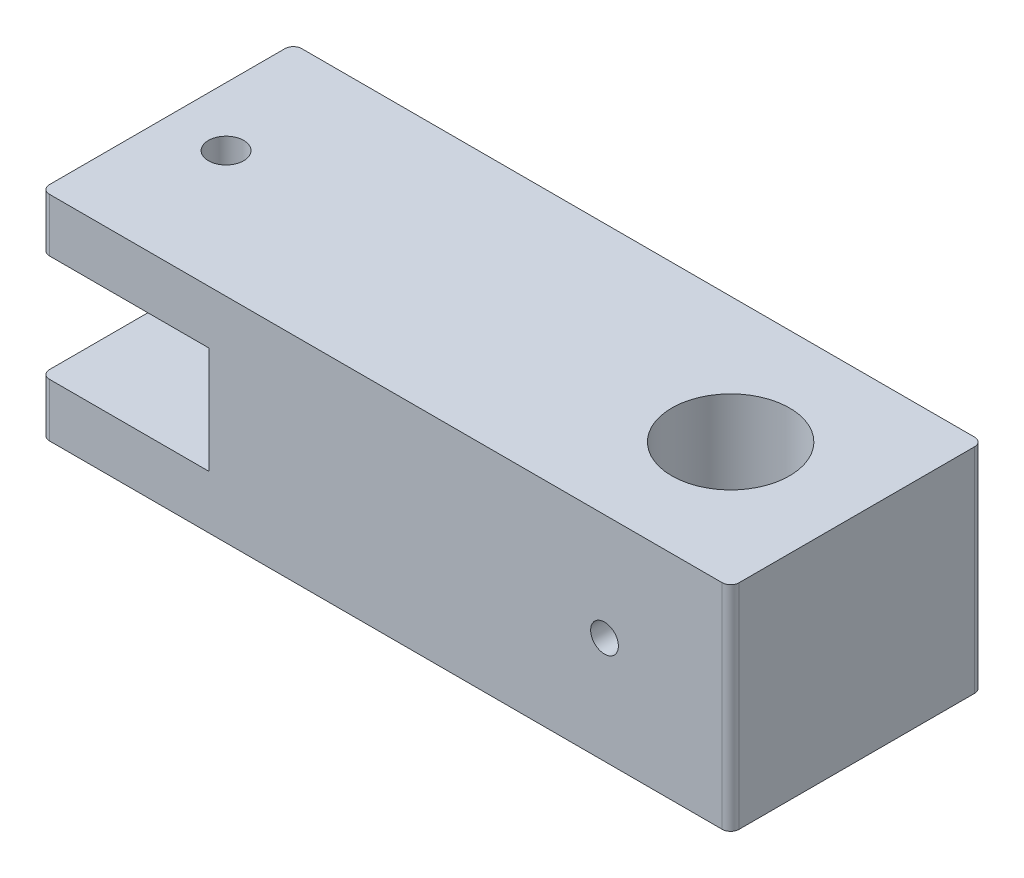
ISO-10303-21;
HEADER;
FILE_DESCRIPTION(('STEP AP214'),'2;1');
FILE_NAME('part.step','',(''),(''),'','','');
FILE_SCHEMA(('AUTOMOTIVE_DESIGN { 1 0 10303 214 1 1 1 1 }'));
ENDSEC;
DATA;
#1=APPLICATION_CONTEXT('core data for automotive mechanical design processes');
#2=APPLICATION_PROTOCOL_DEFINITION('international standard','automotive_design',2000,#1);
#3=PRODUCT_CONTEXT('',#1,'mechanical');
#4=PRODUCT('Part','Part','',(#3));
#5=PRODUCT_RELATED_PRODUCT_CATEGORY('part','',(#4));
#6=PRODUCT_DEFINITION_FORMATION('','',#4);
#7=PRODUCT_DEFINITION_CONTEXT('part definition',#1,'design');
#8=PRODUCT_DEFINITION('design','',#6,#7);
#9=PRODUCT_DEFINITION_SHAPE('','',#8);
#10=(LENGTH_UNIT() NAMED_UNIT(*) SI_UNIT(.MILLI.,.METRE.));
#11=(NAMED_UNIT(*) PLANE_ANGLE_UNIT() SI_UNIT($,.RADIAN.));
#12=(NAMED_UNIT(*) SI_UNIT($,.STERADIAN.) SOLID_ANGLE_UNIT());
#13=UNCERTAINTY_MEASURE_WITH_UNIT(LENGTH_MEASURE(1.E-05),#10,'distance_accuracy_value','');
#14=(GEOMETRIC_REPRESENTATION_CONTEXT(3) GLOBAL_UNCERTAINTY_ASSIGNED_CONTEXT((#13)) GLOBAL_UNIT_ASSIGNED_CONTEXT((#10,
#11,#12)) REPRESENTATION_CONTEXT('',''));
#15=CARTESIAN_POINT('',(0.,0.,0.));
#16=DIRECTION('',(0.,0.,1.));
#17=DIRECTION('',(1.,0.,0.));
#18=AXIS2_PLACEMENT_3D('',#15,#16,#17);
#19=CARTESIAN_POINT('',(-67.,-25.4,-15.));
#20=DIRECTION('',(-1.,0.,0.));
#21=DIRECTION('',(0.,0.,1.));
#22=AXIS2_PLACEMENT_3D('',#19,#20,#21);
#23=PLANE('',#22);
#24=DIRECTION('',(0.,0.,1.));
#25=VECTOR('',#24,1.);
#26=CARTESIAN_POINT('',(-67.,-19.05,-17.));
#27=LINE('',#26,#25);
#28=CARTESIAN_POINT('',(-67.,-19.05,-14.));
#29=VERTEX_POINT('',#28);
#30=CARTESIAN_POINT('',(-67.,-19.05,14.));
#31=VERTEX_POINT('',#30);
#32=EDGE_CURVE('E155',#29,#31,#27,.T.);
#33=ORIENTED_EDGE('',*,*,#32,.F.);
#34=DIRECTION('',(0.,1.,0.));
#35=VECTOR('',#34,1.);
#36=CARTESIAN_POINT('',(-67.,-25.4,-14.));
#37=LINE('',#36,#35);
#38=CARTESIAN_POINT('',(-67.,-25.4,-14.));
#39=VERTEX_POINT('',#38);
#40=EDGE_CURVE('E262',#29,#39,#37,.F.);
#41=ORIENTED_EDGE('',*,*,#40,.T.);
#42=DIRECTION('',(0.,0.,1.));
#43=VECTOR('',#42,1.);
#44=CARTESIAN_POINT('',(-67.,-25.4,-15.));
#45=LINE('',#44,#43);
#46=CARTESIAN_POINT('',(-67.,-25.4,14.));
#47=VERTEX_POINT('',#46);
#48=EDGE_CURVE('E203',#39,#47,#45,.T.);
#49=ORIENTED_EDGE('',*,*,#48,.T.);
#50=DIRECTION('',(0.,1.,0.));
#51=VECTOR('',#50,1.);
#52=CARTESIAN_POINT('',(-67.,-25.4,14.));
#53=LINE('',#52,#51);
#54=EDGE_CURVE('E259',#47,#31,#53,.T.);
#55=ORIENTED_EDGE('',*,*,#54,.T.);
#56=EDGE_LOOP('',(#33,#41,#49,#55));
#57=FACE_BOUND('',#56,.T.);
#58=ADVANCED_FACE('F33',(#57),#23,.T.);
#59=CARTESIAN_POINT('',(-60.,-25.4,0.));
#60=DIRECTION('',(0.,1.,0.));
#61=DIRECTION('',(0.,0.,1.));
#62=AXIS2_PLACEMENT_3D('',#59,#60,#61);
#63=CYLINDRICAL_SURFACE('',#62,2.1);
#64=CARTESIAN_POINT('',(-60.,-25.4,0.));
#65=DIRECTION('',(0.,1.,0.));
#66=DIRECTION('',(0.,0.,1.));
#67=AXIS2_PLACEMENT_3D('',#64,#65,#66);
#68=CIRCLE('',#67,2.1);
#69=CARTESIAN_POINT('',(-60.,-25.4,2.1));
#70=VERTEX_POINT('',#69);
#71=EDGE_CURVE('E191',#70,#70,#68,.T.);
#72=ORIENTED_EDGE('',*,*,#71,.F.);
#73=EDGE_LOOP('',(#72));
#74=FACE_BOUND('',#73,.T.);
#75=CARTESIAN_POINT('',(-60.,-19.05,0.));
#76=DIRECTION('',(0.,1.,0.));
#77=DIRECTION('',(0.,0.,1.));
#78=AXIS2_PLACEMENT_3D('',#75,#76,#77);
#79=CIRCLE('',#78,2.1);
#80=CARTESIAN_POINT('',(-60.,-19.05,2.1));
#81=VERTEX_POINT('',#80);
#82=EDGE_CURVE('E176',#81,#81,#79,.F.);
#83=ORIENTED_EDGE('',*,*,#82,.F.);
#84=EDGE_LOOP('',(#83));
#85=FACE_BOUND('',#84,.T.);
#86=ADVANCED_FACE('F302',(#74,#85),#63,.F.);
#87=CARTESIAN_POINT('',(15.,-25.4,-15.));
#88=DIRECTION('',(1.,0.,0.));
#89=DIRECTION('',(0.,0.,-1.));
#90=AXIS2_PLACEMENT_3D('',#87,#88,#89);
#91=PLANE('',#90);
#92=DIRECTION('',(0.,0.,-1.));
#93=VECTOR('',#92,1.);
#94=CARTESIAN_POINT('',(15.,-25.4,-15.));
#95=LINE('',#94,#93);
#96=CARTESIAN_POINT('',(15.,-25.4,14.));
#97=VERTEX_POINT('',#96);
#98=CARTESIAN_POINT('',(15.,-25.4,-14.));
#99=VERTEX_POINT('',#98);
#100=EDGE_CURVE('E197',#97,#99,#95,.T.);
#101=ORIENTED_EDGE('',*,*,#100,.T.);
#102=DIRECTION('',(0.,1.,0.));
#103=VECTOR('',#102,1.);
#104=CARTESIAN_POINT('',(15.,-25.4,-14.));
#105=LINE('',#104,#103);
#106=CARTESIAN_POINT('',(15.,0.,-14.));
#107=VERTEX_POINT('',#106);
#108=EDGE_CURVE('E11',#99,#107,#105,.T.);
#109=ORIENTED_EDGE('',*,*,#108,.T.);
#110=DIRECTION('',(0.,0.,-1.));
#111=VECTOR('',#110,1.);
#112=CARTESIAN_POINT('',(15.,0.,-15.));
#113=LINE('',#112,#111);
#114=CARTESIAN_POINT('',(15.,0.,14.));
#115=VERTEX_POINT('',#114);
#116=EDGE_CURVE('E194',#115,#107,#113,.T.);
#117=ORIENTED_EDGE('',*,*,#116,.F.);
#118=DIRECTION('',(0.,1.,0.));
#119=VECTOR('',#118,1.);
#120=CARTESIAN_POINT('',(15.,-25.4,14.));
#121=LINE('',#120,#119);
#122=EDGE_CURVE('E47',#115,#97,#121,.F.);
#123=ORIENTED_EDGE('',*,*,#122,.T.);
#124=EDGE_LOOP('',(#101,#109,#117,#123));
#125=FACE_BOUND('',#124,.T.);
#126=ADVANCED_FACE('F309',(#125),#91,.T.);
#127=CARTESIAN_POINT('',(-67.,-25.4,15.));
#128=DIRECTION('',(0.,0.,1.));
#129=DIRECTION('',(1.,0.,0.));
#130=AXIS2_PLACEMENT_3D('',#127,#128,#129);
#131=PLANE('',#130);
#132=CARTESIAN_POINT('',(0.,-12.7,15.));
#133=DIRECTION('',(0.,0.,1.));
#134=DIRECTION('',(1.,0.,0.));
#135=AXIS2_PLACEMENT_3D('',#132,#133,#134);
#136=CIRCLE('',#135,1.65);
#137=CARTESIAN_POINT('',(1.65,-12.7,15.));
#138=VERTEX_POINT('',#137);
#139=EDGE_CURVE('E517',#138,#138,#136,.T.);
#140=ORIENTED_EDGE('',*,*,#139,.F.);
#141=EDGE_LOOP('',(#140));
#142=FACE_BOUND('',#141,.T.);
#143=DIRECTION('',(1.,0.,0.));
#144=VECTOR('',#143,1.);
#145=CARTESIAN_POINT('',(-67.,0.,15.));
#146=LINE('',#145,#144);
#147=CARTESIAN_POINT('',(-66.,0.,15.));
#148=VERTEX_POINT('',#147);
#149=CARTESIAN_POINT('',(14.,0.,15.));
#150=VERTEX_POINT('',#149);
#151=EDGE_CURVE('E200',#148,#150,#146,.T.);
#152=ORIENTED_EDGE('',*,*,#151,.F.);
#153=DIRECTION('',(0.,1.,0.));
#154=VECTOR('',#153,1.);
#155=CARTESIAN_POINT('',(-66.,-25.4,15.));
#156=LINE('',#155,#154);
#157=CARTESIAN_POINT('',(-66.,-6.35,15.));
#158=VERTEX_POINT('',#157);
#159=EDGE_CURVE('E242',#148,#158,#156,.F.);
#160=ORIENTED_EDGE('',*,*,#159,.T.);
#161=DIRECTION('',(-1.,0.,0.));
#162=VECTOR('',#161,1.);
#163=CARTESIAN_POINT('',(-47.,-6.35,15.));
#164=LINE('',#163,#162);
#165=CARTESIAN_POINT('',(-47.,-6.35,15.));
#166=VERTEX_POINT('',#165);
#167=EDGE_CURVE('E165',#166,#158,#164,.T.);
#168=ORIENTED_EDGE('',*,*,#167,.F.);
#169=DIRECTION('',(0.,-1.,0.));
#170=VECTOR('',#169,1.);
#171=CARTESIAN_POINT('',(-47.,-6.35,15.));
#172=LINE('',#171,#170);
#173=CARTESIAN_POINT('',(-47.,-19.05,15.));
#174=VERTEX_POINT('',#173);
#175=EDGE_CURVE('E148',#166,#174,#172,.T.);
#176=ORIENTED_EDGE('',*,*,#175,.T.);
#177=DIRECTION('',(-1.,0.,0.));
#178=VECTOR('',#177,1.);
#179=CARTESIAN_POINT('',(-47.,-19.05,15.));
#180=LINE('',#179,#178);
#181=CARTESIAN_POINT('',(-66.,-19.05,15.));
#182=VERTEX_POINT('',#181);
#183=EDGE_CURVE('E158',#174,#182,#180,.T.);
#184=ORIENTED_EDGE('',*,*,#183,.T.);
#185=DIRECTION('',(0.,1.,0.));
#186=VECTOR('',#185,1.);
#187=CARTESIAN_POINT('',(-66.,-25.4,15.));
#188=LINE('',#187,#186);
#189=CARTESIAN_POINT('',(-66.,-25.4,15.));
#190=VERTEX_POINT('',#189);
#191=EDGE_CURVE('E237',#182,#190,#188,.F.);
#192=ORIENTED_EDGE('',*,*,#191,.T.);
#193=DIRECTION('',(1.,0.,0.));
#194=VECTOR('',#193,1.);
#195=CARTESIAN_POINT('',(-67.,-25.4,15.));
#196=LINE('',#195,#194);
#197=CARTESIAN_POINT('',(14.,-25.4,15.));
#198=VERTEX_POINT('',#197);
#199=EDGE_CURVE('E206',#190,#198,#196,.T.);
#200=ORIENTED_EDGE('',*,*,#199,.T.);
#201=DIRECTION('',(0.,1.,0.));
#202=VECTOR('',#201,1.);
#203=CARTESIAN_POINT('',(14.,-25.4,15.));
#204=LINE('',#203,#202);
#205=EDGE_CURVE('E239',#198,#150,#204,.T.);
#206=ORIENTED_EDGE('',*,*,#205,.T.);
#207=EDGE_LOOP('',(#152,#160,#168,#176,#184,#192,#200,#206));
#208=FACE_BOUND('',#207,.T.);
#209=ADVANCED_FACE('F168',(#142,#208),#131,.T.);
#210=DIRECTION('',(0.,0.,1.));
#211=VECTOR('',#210,1.);
#212=CARTESIAN_POINT('',(-67.,-6.35,-17.));
#213=LINE('',#212,#211);
#214=CARTESIAN_POINT('',(-67.,-6.35,-14.));
#215=VERTEX_POINT('',#214);
#216=CARTESIAN_POINT('',(-67.,-6.35,14.));
#217=VERTEX_POINT('',#216);
#218=EDGE_CURVE('E170',#215,#217,#213,.T.);
#219=ORIENTED_EDGE('',*,*,#218,.T.);
#220=DIRECTION('',(0.,1.,0.));
#221=VECTOR('',#220,1.);
#222=CARTESIAN_POINT('',(-67.,-25.4,14.));
#223=LINE('',#222,#221);
#224=CARTESIAN_POINT('',(-67.,0.,14.));
#225=VERTEX_POINT('',#224);
#226=EDGE_CURVE('E226',#217,#225,#223,.T.);
#227=ORIENTED_EDGE('',*,*,#226,.T.);
#228=DIRECTION('',(0.,0.,1.));
#229=VECTOR('',#228,1.);
#230=CARTESIAN_POINT('',(-67.,0.,-15.));
#231=LINE('',#230,#229);
#232=CARTESIAN_POINT('',(-67.,0.,-14.));
#233=VERTEX_POINT('',#232);
#234=EDGE_CURVE('E214',#233,#225,#231,.T.);
#235=ORIENTED_EDGE('',*,*,#234,.F.);
#236=DIRECTION('',(0.,1.,0.));
#237=VECTOR('',#236,1.);
#238=CARTESIAN_POINT('',(-67.,-25.4,-14.));
#239=LINE('',#238,#237);
#240=EDGE_CURVE('E224',#233,#215,#239,.F.);
#241=ORIENTED_EDGE('',*,*,#240,.T.);
#242=EDGE_LOOP('',(#219,#227,#235,#241));
#243=FACE_BOUND('',#242,.T.);
#244=ADVANCED_FACE('F305',(#243),#23,.T.);
#245=CARTESIAN_POINT('',(-67.,-25.4,-15.));
#246=DIRECTION('',(0.,0.,-1.));
#247=DIRECTION('',(-1.,0.,0.));
#248=AXIS2_PLACEMENT_3D('',#245,#246,#247);
#249=PLANE('',#248);
#250=CARTESIAN_POINT('',(0.,-12.7,-15.));
#251=DIRECTION('',(0.,0.,1.));
#252=DIRECTION('',(1.,0.,0.));
#253=AXIS2_PLACEMENT_3D('',#250,#251,#252);
#254=CIRCLE('',#253,1.65);
#255=CARTESIAN_POINT('',(1.65,-12.7,-15.));
#256=VERTEX_POINT('',#255);
#257=EDGE_CURVE('E276',#256,#256,#254,.T.);
#258=ORIENTED_EDGE('',*,*,#257,.T.);
#259=EDGE_LOOP('',(#258));
#260=FACE_BOUND('',#259,.T.);
#261=DIRECTION('',(1.,0.,0.));
#262=VECTOR('',#261,1.);
#263=CARTESIAN_POINT('',(-67.,-6.35,-15.));
#264=LINE('',#263,#262);
#265=CARTESIAN_POINT('',(-66.,-6.35,-15.));
#266=VERTEX_POINT('',#265);
#267=CARTESIAN_POINT('',(-47.,-6.35,-15.));
#268=VERTEX_POINT('',#267);
#269=EDGE_CURVE('E182',#266,#268,#264,.T.);
#270=ORIENTED_EDGE('',*,*,#269,.F.);
#271=DIRECTION('',(0.,1.,0.));
#272=VECTOR('',#271,1.);
#273=CARTESIAN_POINT('',(-66.,-25.4,-15.));
#274=LINE('',#273,#272);
#275=CARTESIAN_POINT('',(-66.,0.,-15.));
#276=VERTEX_POINT('',#275);
#277=EDGE_CURVE('E253',#266,#276,#274,.T.);
#278=ORIENTED_EDGE('',*,*,#277,.T.);
#279=DIRECTION('',(-1.,0.,0.));
#280=VECTOR('',#279,1.);
#281=CARTESIAN_POINT('',(-67.,0.,-15.));
#282=LINE('',#281,#280);
#283=CARTESIAN_POINT('',(14.,0.,-15.));
#284=VERTEX_POINT('',#283);
#285=EDGE_CURVE('E211',#284,#276,#282,.T.);
#286=ORIENTED_EDGE('',*,*,#285,.F.);
#287=DIRECTION('',(0.,1.,0.));
#288=VECTOR('',#287,1.);
#289=CARTESIAN_POINT('',(14.,-25.4,-15.));
#290=LINE('',#289,#288);
#291=CARTESIAN_POINT('',(14.,-25.4,-15.));
#292=VERTEX_POINT('',#291);
#293=EDGE_CURVE('E248',#284,#292,#290,.F.);
#294=ORIENTED_EDGE('',*,*,#293,.T.);
#295=DIRECTION('',(-1.,0.,0.));
#296=VECTOR('',#295,1.);
#297=CARTESIAN_POINT('',(-67.,-25.4,-15.));
#298=LINE('',#297,#296);
#299=CARTESIAN_POINT('',(-66.,-25.4,-15.));
#300=VERTEX_POINT('',#299);
#301=EDGE_CURVE('E199',#292,#300,#298,.T.);
#302=ORIENTED_EDGE('',*,*,#301,.T.);
#303=DIRECTION('',(0.,1.,0.));
#304=VECTOR('',#303,1.);
#305=CARTESIAN_POINT('',(-66.,-25.4,-15.));
#306=LINE('',#305,#304);
#307=CARTESIAN_POINT('',(-66.,-19.05,-15.));
#308=VERTEX_POINT('',#307);
#309=EDGE_CURVE('E250',#300,#308,#306,.T.);
#310=ORIENTED_EDGE('',*,*,#309,.T.);
#311=DIRECTION('',(1.,0.,0.));
#312=VECTOR('',#311,1.);
#313=CARTESIAN_POINT('',(-67.,-19.05,-15.));
#314=LINE('',#313,#312);
#315=CARTESIAN_POINT('',(-47.,-19.05,-15.));
#316=VERTEX_POINT('',#315);
#317=EDGE_CURVE('E179',#308,#316,#314,.T.);
#318=ORIENTED_EDGE('',*,*,#317,.T.);
#319=DIRECTION('',(0.,1.,0.));
#320=VECTOR('',#319,1.);
#321=CARTESIAN_POINT('',(-47.,-25.4,-15.));
#322=LINE('',#321,#320);
#323=EDGE_CURVE('E151',#316,#268,#322,.T.);
#324=ORIENTED_EDGE('',*,*,#323,.T.);
#325=EDGE_LOOP('',(#270,#278,#286,#294,#302,#310,#318,#324));
#326=FACE_BOUND('',#325,.T.);
#327=ADVANCED_FACE('F315',(#260,#326),#249,.T.);
#328=CARTESIAN_POINT('',(0.,-25.4,0.));
#329=DIRECTION('',(0.,1.,0.));
#330=DIRECTION('',(0.,0.,1.));
#331=AXIS2_PLACEMENT_3D('',#328,#329,#330);
#332=PLANE('',#331);
#333=CARTESIAN_POINT('',(0.,-25.4,0.));
#334=DIRECTION('',(0.,1.,0.));
#335=DIRECTION('',(0.,0.,1.));
#336=AXIS2_PLACEMENT_3D('',#333,#334,#335);
#337=CIRCLE('',#336,7.);
#338=CARTESIAN_POINT('',(0.,-25.4,7.));
#339=VERTEX_POINT('',#338);
#340=EDGE_CURVE('E185',#339,#339,#337,.T.);
#341=ORIENTED_EDGE('',*,*,#340,.T.);
#342=EDGE_LOOP('',(#341));
#343=FACE_BOUND('',#342,.T.);
#344=ORIENTED_EDGE('',*,*,#71,.T.);
#345=EDGE_LOOP('',(#344));
#346=FACE_BOUND('',#345,.T.);
#347=ORIENTED_EDGE('',*,*,#48,.F.);
#348=CARTESIAN_POINT('',(-66.,-25.4,-14.));
#349=DIRECTION('',(0.,1.,0.));
#350=DIRECTION('',(0.,0.,1.));
#351=AXIS2_PLACEMENT_3D('',#348,#349,#350);
#352=CIRCLE('',#351,1.);
#353=EDGE_CURVE('E269',#39,#300,#352,.F.);
#354=ORIENTED_EDGE('',*,*,#353,.T.);
#355=ORIENTED_EDGE('',*,*,#301,.F.);
#356=CARTESIAN_POINT('',(14.,-25.4,-14.));
#357=DIRECTION('',(0.,1.,0.));
#358=DIRECTION('',(0.,0.,1.));
#359=AXIS2_PLACEMENT_3D('',#356,#357,#358);
#360=CIRCLE('',#359,1.);
#361=EDGE_CURVE('E55',#292,#99,#360,.F.);
#362=ORIENTED_EDGE('',*,*,#361,.T.);
#363=ORIENTED_EDGE('',*,*,#100,.F.);
#364=CARTESIAN_POINT('',(14.,-25.4,14.));
#365=DIRECTION('',(0.,1.,0.));
#366=DIRECTION('',(0.,0.,1.));
#367=AXIS2_PLACEMENT_3D('',#364,#365,#366);
#368=CIRCLE('',#367,1.);
#369=EDGE_CURVE('E266',#97,#198,#368,.F.);
#370=ORIENTED_EDGE('',*,*,#369,.T.);
#371=ORIENTED_EDGE('',*,*,#199,.F.);
#372=CARTESIAN_POINT('',(-66.,-25.4,14.));
#373=DIRECTION('',(0.,1.,0.));
#374=DIRECTION('',(0.,0.,1.));
#375=AXIS2_PLACEMENT_3D('',#372,#373,#374);
#376=CIRCLE('',#375,1.);
#377=EDGE_CURVE('E264',#190,#47,#376,.F.);
#378=ORIENTED_EDGE('',*,*,#377,.T.);
#379=EDGE_LOOP('',(#347,#354,#355,#362,#363,#370,#371,#378));
#380=FACE_BOUND('',#379,.T.);
#381=ADVANCED_FACE('F321',(#343,#346,#380),#332,.F.);
#382=CARTESIAN_POINT('',(0.,0.,0.));
#383=DIRECTION('',(0.,1.,0.));
#384=DIRECTION('',(0.,0.,1.));
#385=AXIS2_PLACEMENT_3D('',#382,#383,#384);
#386=PLANE('',#385);
#387=CARTESIAN_POINT('',(0.,0.,0.));
#388=DIRECTION('',(0.,1.,0.));
#389=DIRECTION('',(0.,0.,1.));
#390=AXIS2_PLACEMENT_3D('',#387,#388,#389);
#391=CIRCLE('',#390,7.);
#392=CARTESIAN_POINT('',(0.,0.,7.));
#393=VERTEX_POINT('',#392);
#394=EDGE_CURVE('E184',#393,#393,#391,.T.);
#395=ORIENTED_EDGE('',*,*,#394,.F.);
#396=EDGE_LOOP('',(#395));
#397=FACE_BOUND('',#396,.T.);
#398=CARTESIAN_POINT('',(-60.,0.,0.));
#399=DIRECTION('',(0.,1.,0.));
#400=DIRECTION('',(0.,0.,1.));
#401=AXIS2_PLACEMENT_3D('',#398,#399,#400);
#402=CIRCLE('',#401,2.1);
#403=CARTESIAN_POINT('',(-60.,0.,2.1));
#404=VERTEX_POINT('',#403);
#405=EDGE_CURVE('E188',#404,#404,#402,.T.);
#406=ORIENTED_EDGE('',*,*,#405,.F.);
#407=EDGE_LOOP('',(#406));
#408=FACE_BOUND('',#407,.T.);
#409=ORIENTED_EDGE('',*,*,#234,.T.);
#410=CARTESIAN_POINT('',(-66.,0.,14.));
#411=DIRECTION('',(0.,1.,0.));
#412=DIRECTION('',(0.,0.,1.));
#413=AXIS2_PLACEMENT_3D('',#410,#411,#412);
#414=CIRCLE('',#413,1.);
#415=EDGE_CURVE('E235',#225,#148,#414,.T.);
#416=ORIENTED_EDGE('',*,*,#415,.T.);
#417=ORIENTED_EDGE('',*,*,#151,.T.);
#418=CARTESIAN_POINT('',(14.,0.,14.));
#419=DIRECTION('',(0.,1.,0.));
#420=DIRECTION('',(0.,0.,1.));
#421=AXIS2_PLACEMENT_3D('',#418,#419,#420);
#422=CIRCLE('',#421,1.);
#423=EDGE_CURVE('E229',#150,#115,#422,.T.);
#424=ORIENTED_EDGE('',*,*,#423,.T.);
#425=ORIENTED_EDGE('',*,*,#116,.T.);
#426=CARTESIAN_POINT('',(14.,0.,-14.));
#427=DIRECTION('',(0.,1.,0.));
#428=DIRECTION('',(0.,0.,1.));
#429=AXIS2_PLACEMENT_3D('',#426,#427,#428);
#430=CIRCLE('',#429,1.);
#431=EDGE_CURVE('E231',#107,#284,#430,.T.);
#432=ORIENTED_EDGE('',*,*,#431,.T.);
#433=ORIENTED_EDGE('',*,*,#285,.T.);
#434=CARTESIAN_POINT('',(-66.,0.,-14.));
#435=DIRECTION('',(0.,1.,0.));
#436=DIRECTION('',(0.,0.,1.));
#437=AXIS2_PLACEMENT_3D('',#434,#435,#436);
#438=CIRCLE('',#437,1.);
#439=EDGE_CURVE('E233',#276,#233,#438,.T.);
#440=ORIENTED_EDGE('',*,*,#439,.T.);
#441=EDGE_LOOP('',(#409,#416,#417,#424,#425,#432,#433,#440));
#442=FACE_BOUND('',#441,.T.);
#443=ADVANCED_FACE('F333',(#397,#408,#442),#386,.T.);
#444=CARTESIAN_POINT('',(-60.,-6.35,0.));
#445=DIRECTION('',(0.,1.,0.));
#446=DIRECTION('',(0.,0.,1.));
#447=AXIS2_PLACEMENT_3D('',#444,#445,#446);
#448=CIRCLE('',#447,2.1);
#449=CARTESIAN_POINT('',(-60.,-6.35,2.1));
#450=VERTEX_POINT('',#449);
#451=EDGE_CURVE('E181',#450,#450,#448,.F.);
#452=ORIENTED_EDGE('',*,*,#451,.T.);
#453=EDGE_LOOP('',(#452));
#454=FACE_BOUND('',#453,.T.);
#455=ORIENTED_EDGE('',*,*,#405,.T.);
#456=EDGE_LOOP('',(#455));
#457=FACE_BOUND('',#456,.T.);
#458=ADVANCED_FACE('F298',(#454,#457),#63,.F.);
#459=CARTESIAN_POINT('',(0.,-25.4,0.));
#460=DIRECTION('',(0.,1.,0.));
#461=DIRECTION('',(0.,0.,1.));
#462=AXIS2_PLACEMENT_3D('',#459,#460,#461);
#463=CYLINDRICAL_SURFACE('',#462,7.);
#464=CARTESIAN_POINT('',(0.,-14.35,7.));
#465=CARTESIAN_POINT('',(0.0913287393176132,-14.3499971561209,6.99999836647252));
#466=CARTESIAN_POINT('',(0.182690417283303,-14.3423917691506,6.99819467849873));
#467=CARTESIAN_POINT('',(0.36280632366436,-14.3122100985305,6.9911739036526));
#468=CARTESIAN_POINT('',(0.451558855012933,-14.2896242867252,6.98595464436713));
#469=CARTESIAN_POINT('',(0.623828476855956,-14.2302382259825,6.97268218331077));
#470=CARTESIAN_POINT('',(0.707351348819675,-14.193454007993,6.96463217854926));
#471=CARTESIAN_POINT('',(0.867039208328407,-14.1067691512847,6.9465609541058));
#472=CARTESIAN_POINT('',(0.943204151262113,-14.0568684330471,6.93653972247338));
#473=CARTESIAN_POINT('',(1.0874214344422,-13.9443931783477,6.91541181493805));
#474=CARTESIAN_POINT('',(1.15531854158778,-13.8816224464447,6.90428991213628));
#475=CARTESIAN_POINT('',(1.2797250827413,-13.7456095908267,6.88231817514457));
#476=CARTESIAN_POINT('',(1.33623336463363,-13.6723664089783,6.87146836857753));
#477=CARTESIAN_POINT('',(1.43696684618771,-13.516309632544,6.85111743990827));
#478=CARTESIAN_POINT('',(1.48102236520305,-13.4333837495766,6.84163573776828));
#479=CARTESIAN_POINT('',(1.5545098915109,-13.2610442782979,6.8253150534534));
#480=CARTESIAN_POINT('',(1.58394395433771,-13.1716316039485,6.81847569983819));
#481=CARTESIAN_POINT('',(1.62683125284545,-12.990553027969,6.80836995693017));
#482=CARTESIAN_POINT('',(1.64056162843084,-12.8989562957756,6.80504168835829));
#483=CARTESIAN_POINT('',(1.6525143545755,-12.7147036463359,6.80214944752779));
#484=CARTESIAN_POINT('',(1.65073893306961,-12.622047883166,6.80258493447765));
#485=CARTESIAN_POINT('',(1.63195247769315,-12.4404008192041,6.80711518628286));
#486=CARTESIAN_POINT('',(1.61526770664355,-12.3513735200367,6.81113158544197));
#487=CARTESIAN_POINT('',(1.56765494743683,-12.1774184804874,6.82224669705885));
#488=CARTESIAN_POINT('',(1.53672604569693,-12.092491003444,6.82934560721949));
#489=CARTESIAN_POINT('',(1.46121486998613,-11.9282516029474,6.84590028619908));
#490=CARTESIAN_POINT('',(1.41651088097455,-11.8489978306035,6.85537691977426));
#491=CARTESIAN_POINT('',(1.31480384080152,-11.6989978790521,6.87560701771075));
#492=CARTESIAN_POINT('',(1.25779885989578,-11.6282530374163,6.88636068228985));
#493=CARTESIAN_POINT('',(1.13140044923306,-11.4954052023035,6.90826612497408));
#494=CARTESIAN_POINT('',(1.06173067039407,-11.433565372046,6.91942110106382));
#495=CARTESIAN_POINT('',(0.912878848692459,-11.3224003529991,6.940626418642));
#496=CARTESIAN_POINT('',(0.833696575268989,-11.2730754676331,6.95067673334471));
#497=CARTESIAN_POINT('',(0.667717693598601,-11.1882589765205,6.9685816950737));
#498=CARTESIAN_POINT('',(0.580900533100761,-11.1528062013209,6.97643016161576));
#499=CARTESIAN_POINT('',(0.402313719817366,-11.0970684465634,6.98900179511064));
#500=CARTESIAN_POINT('',(0.310544909289167,-11.0767808961225,6.99372549177409));
#501=CARTESIAN_POINT('',(0.126913198899209,-11.0523423156672,6.9994383716222));
#502=CARTESIAN_POINT('',(0.0351005767602216,-11.0478324033013,7.00051059686152));
#503=CARTESIAN_POINT('',(-0.147966685501655,-11.0540982763691,6.99903444009398));
#504=CARTESIAN_POINT('',(-0.239221369368363,-11.0648728476162,6.99648634568227));
#505=CARTESIAN_POINT('',(-0.41736265301977,-11.1011050792374,6.98810869992012));
#506=CARTESIAN_POINT('',(-0.504290552421104,-11.1263705135243,6.98232213187254));
#507=CARTESIAN_POINT('',(-0.672672276070119,-11.1906506508764,6.96811723407212));
#508=CARTESIAN_POINT('',(-0.75412558464871,-11.2296666469956,6.9596986568229));
#509=CARTESIAN_POINT('',(-0.910700498955396,-11.3210604220864,6.94096161251794));
#510=CARTESIAN_POINT('',(-0.985698570997651,-11.373643860576,6.93061465221504));
#511=CARTESIAN_POINT('',(-1.1259344495591,-11.4904133192425,6.90921937825115));
#512=CARTESIAN_POINT('',(-1.19117076625592,-11.5546011071611,6.89817095790026));
#513=CARTESIAN_POINT('',(-1.31148229591091,-11.694415055306,6.87632466673189));
#514=CARTESIAN_POINT('',(-1.36630717929423,-11.7702586125966,6.865537385707));
#515=CARTESIAN_POINT('',(-1.46244648293612,-11.9302847923245,6.84570445168464));
#516=CARTESIAN_POINT('',(-1.50376150719305,-12.0144670417364,6.83665872083343));
#517=CARTESIAN_POINT('',(-1.57141076668764,-12.1883212744608,6.82142736146698));
#518=CARTESIAN_POINT('',(-1.59783286852026,-12.2779575268584,6.81522499881539));
#519=CARTESIAN_POINT('',(-1.63519178674544,-12.4605656558368,6.80635903572141));
#520=CARTESIAN_POINT('',(-1.64613154940225,-12.5535368943212,6.80369476199233));
#521=CARTESIAN_POINT('',(-1.65207449167986,-12.7376400758363,6.80225382726605));
#522=CARTESIAN_POINT('',(-1.6474761616919,-12.8287586131014,6.8033799546054));
#523=CARTESIAN_POINT('',(-1.62337546677893,-13.0088823636668,6.80917049161347));
#524=CARTESIAN_POINT('',(-1.6038733396724,-13.0978876106654,6.81383484482306));
#525=CARTESIAN_POINT('',(-1.55072477614989,-13.2708801060627,6.82612522897376));
#526=CARTESIAN_POINT('',(-1.51714519678737,-13.3548889577515,6.83373724790254));
#527=CARTESIAN_POINT('',(-1.43684939858625,-13.5161365114797,6.85106877692285));
#528=CARTESIAN_POINT('',(-1.39013156490448,-13.5933743797552,6.86078854604759));
#529=CARTESIAN_POINT('',(-1.28360204537891,-13.7408316517026,6.88152384189012));
#530=CARTESIAN_POINT('',(-1.22351026298738,-13.8108452311053,6.89256431174075));
#531=CARTESIAN_POINT('',(-1.09249493531384,-13.9399248388899,6.91453965388042));
#532=CARTESIAN_POINT('',(-1.02156885982584,-13.9989883028659,6.92547450086677));
#533=CARTESIAN_POINT('',(-0.869562734220027,-14.10538285533,6.9462096972569));
#534=CARTESIAN_POINT('',(-0.788341489140674,-14.1525164535641,6.95598967744618));
#535=CARTESIAN_POINT('',(-0.618909771082385,-14.232386209572,6.97310375804727));
#536=CARTESIAN_POINT('',(-0.53070477860151,-14.2651335273768,6.98043975328753));
#537=CARTESIAN_POINT('',(-0.368778884805455,-14.3099742205005,6.99064750922865));
#538=CARTESIAN_POINT('',(-0.29588194683886,-14.3249532912156,6.99413174237217));
#539=CARTESIAN_POINT('',(-0.148663891408629,-14.3449670438665,6.99880858473134));
#540=CARTESIAN_POINT('',(-0.0743428585838588,-14.3500023149569,7.00000132971399));
#541=CARTESIAN_POINT('',(0.,-14.35,7.));
#542=B_SPLINE_CURVE_WITH_KNOTS('',3,(#464,#465,#466,#467,#468,#469,#470,#471,#472,#473,#474,
#475,#476,#477,#478,#479,#480,#481,#482,#483,#484,#485,#486,#487,#488,#489,#490,#491,#492,#493,
#494,#495,#496,#497,#498,#499,#500,#501,#502,#503,#504,#505,#506,#507,#508,#509,#510,#511,#512,
#513,#514,#515,#516,#517,#518,#519,#520,#521,#522,#523,#524,#525,#526,#527,#528,#529,#530,#531,
#532,#533,#534,#535,#536,#537,#538,#539,#540,#541),.UNSPECIFIED.,.T.,.F.,(4,2,2,2,2,2,2,2,2,2,2,
2,2,2,2,2,2,2,2,2,2,2,2,2,2,2,2,2,2,2,2,2,2,2,2,2,2,2,4),(0.,0.273713930465044,
0.547602121208314,0.821181974218379,1.09476348584582,1.37287554367486,1.65101572175226,
1.93278083587446,2.21450632727553,2.49117922951626,2.76781237894395,3.03853628105219,
3.30927754913057,3.5824831951294,3.85573173204487,4.13587649000042,4.41602803938653,
4.69695826763981,4.97784086042083,5.2522913336597,5.52672000600245,5.79758981692427,
6.0684851062802,6.34375631656428,6.61906949551375,6.90033819981439,7.18159432744312,
7.46117322376553,7.7406989095161,8.01311084713953,8.28551843800227,8.55664670189889,
8.82780830516572,9.10529722607674,9.38285105021362,9.6647365849775,9.94640306170602,
10.1692231938146,10.3920301237803),.UNSPECIFIED.);
#543=CARTESIAN_POINT('',(0.,-14.35,7.));
#544=VERTEX_POINT('',#543);
#545=EDGE_CURVE('E37',#544,#544,#542,.T.);
#546=ORIENTED_EDGE('',*,*,#545,.T.);
#547=EDGE_LOOP('',(#546));
#548=FACE_BOUND('',#547,.T.);
#549=CARTESIAN_POINT('',(1.65,-12.7,-6.80275679412398));
#550=CARTESIAN_POINT('',(1.64999713007316,-12.7912890000235,-6.80275861136205));
#551=CARTESIAN_POINT('',(1.64239813439995,-12.8826109983811,-6.80461440498174));
#552=CARTESIAN_POINT('',(1.61224414767597,-13.062644563434,-6.81182064992733));
#553=CARTESIAN_POINT('',(1.58967946321205,-13.1513543992885,-6.81717336620826));
#554=CARTESIAN_POINT('',(1.53035515036093,-13.3235335125234,-6.83073431325551));
#555=CARTESIAN_POINT('',(1.49361254058449,-13.4070089339595,-6.83893911932177));
#556=CARTESIAN_POINT('',(1.40702581854957,-13.56661653279,-6.85727558075245));
#557=CARTESIAN_POINT('',(1.3571815350499,-13.6427486141879,-6.86740726130097));
#558=CARTESIAN_POINT('',(1.24476461908351,-13.7869998286859,-6.88867782513987));
#559=CARTESIAN_POINT('',(1.18198309355867,-13.8549540452772,-6.89983131541127));
#560=CARTESIAN_POINT('',(1.04592427298928,-13.9794717117012,-6.92176152937784));
#561=CARTESIAN_POINT('',(0.972646078487493,-14.0360341843775,-6.93253822068664));
#562=CARTESIAN_POINT('',(0.816555491676992,-14.1368269698173,-6.95266103704034));
#563=CARTESIAN_POINT('',(0.733636814479662,-14.1808968612328,-6.96198791366554));
#564=CARTESIAN_POINT('',(0.561312838562634,-14.2544129082778,-6.97799434603916));
#565=CARTESIAN_POINT('',(0.47190838960137,-14.2838609756902,-6.98467424785277));
#566=CARTESIAN_POINT('',(0.290868022052412,-14.3267737021711,-6.99453084372035));
#567=CARTESIAN_POINT('',(0.199301775715458,-14.3405179939669,-6.99776875317269));
#568=CARTESIAN_POINT('',(0.0151097839078763,-14.3525091367613,-7.00058928212562));
#569=CARTESIAN_POINT('',(-0.0775158200378365,-14.350758034263,-7.00017238432294));
#570=CARTESIAN_POINT('',(-0.259263367840033,-14.3320125949898,-6.99577641572093));
#571=CARTESIAN_POINT('',(-0.348418380319069,-14.3153198849955,-6.99186783471482));
#572=CARTESIAN_POINT('',(-0.522624624983761,-14.2676479255643,-6.98100889430398));
#573=CARTESIAN_POINT('',(-0.6076756529831,-14.2366679660991,-6.97405838372646));
#574=CARTESIAN_POINT('',(-0.77207438679455,-14.1610462296067,-6.95778608866946));
#575=CARTESIAN_POINT('',(-0.851369239725044,-14.1162938295303,-6.94844521053821));
#576=CARTESIAN_POINT('',(-1.00143136070301,-14.014480774115,-6.92841069918988));
#577=CARTESIAN_POINT('',(-1.07219729215003,-13.957418193499,-6.91771685448099));
#578=CARTESIAN_POINT('',(-1.20498965605832,-13.830975474906,-6.89584251761335));
#579=CARTESIAN_POINT('',(-1.26676421005725,-13.7613315043055,-6.88465650871199));
#580=CARTESIAN_POINT('',(-1.37780936391993,-13.6125556788502,-6.8632971795881));
#581=CARTESIAN_POINT('',(-1.42707950447265,-13.5334234756316,-6.85312389657327));
#582=CARTESIAN_POINT('',(-1.51185477157774,-13.3674647401929,-6.83492437266263));
#583=CARTESIAN_POINT('',(-1.54730546989208,-13.2806094060491,-6.82690665922475));
#584=CARTESIAN_POINT('',(-1.6030277151278,-13.1019387224308,-6.8140390867396));
#585=CARTESIAN_POINT('',(-1.62330210645788,-13.0101243058692,-6.80918863409247));
#586=CARTESIAN_POINT('',(-1.64769127898038,-12.8264614430508,-6.80332774943589));
#587=CARTESIAN_POINT('',(-1.65217579860456,-12.7346648402699,-6.80222947433876));
#588=CARTESIAN_POINT('',(-1.64586488795024,-12.5516354234163,-6.80375919481422));
#589=CARTESIAN_POINT('',(-1.63507069283233,-12.4604025643681,-6.80638688917233));
#590=CARTESIAN_POINT('',(-1.59883140460811,-12.2824225492525,-6.81498886694796));
#591=CARTESIAN_POINT('',(-1.57359604251707,-12.1956301543463,-6.82091521063605));
#592=CARTESIAN_POINT('',(-1.50942069873872,-12.0275063133655,-6.83540229380028));
#593=CARTESIAN_POINT('',(-1.47047923644584,-11.9461754584062,-6.84396331787599));
#594=CARTESIAN_POINT('',(-1.37920410959564,-11.7897009434106,-6.86294389007106));
#595=CARTESIAN_POINT('',(-1.32664621508517,-11.7146918152575,-6.87339357272798));
#596=CARTESIAN_POINT('',(-1.20991829013253,-11.5744219937018,-6.89489755256543));
#597=CARTESIAN_POINT('',(-1.14574657256198,-11.5091627191684,-6.90595193742742));
#598=CARTESIAN_POINT('',(-1.00592681617982,-11.3887770179575,-6.92771364919943));
#599=CARTESIAN_POINT('',(-0.930057660220528,-11.3339046445284,-6.93840801965822));
#600=CARTESIAN_POINT('',(-0.769965220758946,-11.2376819832221,-6.95799159344945));
#601=CARTESIAN_POINT('',(-0.685742356354557,-11.196331017435,-6.96688088727282));
#602=CARTESIAN_POINT('',(-0.511894272134557,-11.1286621610667,-6.98179887024889));
#603=CARTESIAN_POINT('',(-0.422310877248031,-11.1022413254324,-6.98784709878863));
#604=CARTESIAN_POINT('',(-0.239816201973848,-11.0648671310585,-6.99648655479454));
#605=CARTESIAN_POINT('',(-0.146905491020366,-11.0539111385267,-6.99907837091255));
#606=CARTESIAN_POINT('',(0.0372082467747375,-11.0479118694287,-7.00049202890772));
#607=CARTESIAN_POINT('',(0.128398504210688,-11.052491675739,-6.9994031706394));
#608=CARTESIAN_POINT('',(0.308670729816518,-11.0765802472947,-6.99377268350157));
#609=CARTESIAN_POINT('',(0.39775274835933,-11.0960886554734,-6.98923113721447));
#610=CARTESIAN_POINT('',(0.570933576895642,-11.1492882389107,-6.97721604451341));
#611=CARTESIAN_POINT('',(0.655052149359146,-11.1829181294887,-6.96975517685192));
#612=CARTESIAN_POINT('',(0.81649879536476,-11.2633490089208,-6.95269208722048));
#613=CARTESIAN_POINT('',(0.893826099578997,-11.3101514874724,-6.94308962308136));
#614=CARTESIAN_POINT('',(1.04130725997212,-11.4167860964467,-6.92252474173611));
#615=CARTESIAN_POINT('',(1.11126948147334,-11.4768784697949,-6.91153737485731));
#616=CARTESIAN_POINT('',(1.24024523339421,-11.6078723975111,-6.88956325338245));
#617=CARTESIAN_POINT('',(1.29925605605595,-11.6787766172591,-6.87857649960749));
#618=CARTESIAN_POINT('',(1.40557849643651,-11.8307545938553,-6.85764827463158));
#619=CARTESIAN_POINT('',(1.45268661539722,-11.9119736114787,-6.84772646444862));
#620=CARTESIAN_POINT('',(1.53250931126199,-12.0813973337531,-6.83030721412674));
#621=CARTESIAN_POINT('',(1.56523518241758,-12.1695964924944,-6.82280787287529));
#622=CARTESIAN_POINT('',(1.61002842680636,-12.3314691544095,-6.81235745600281));
#623=CARTESIAN_POINT('',(1.62498700416516,-12.4043160048443,-6.80878274857867));
#624=CARTESIAN_POINT('',(1.64497362976398,-12.5514346815323,-6.8039817559383));
#625=CARTESIAN_POINT('',(1.65000233562815,-12.625706413091,-6.80275531520391));
#626=CARTESIAN_POINT('',(1.65,-12.7,-6.80275679412398));
#627=B_SPLINE_CURVE_WITH_KNOTS('',3,(#549,#550,#551,#552,#553,#554,#555,#556,#557,#558,#559,
#560,#561,#562,#563,#564,#565,#566,#567,#568,#569,#570,#571,#572,#573,#574,#575,#576,#577,#578,
#579,#580,#581,#582,#583,#584,#585,#586,#587,#588,#589,#590,#591,#592,#593,#594,#595,#596,#597,
#598,#599,#600,#601,#602,#603,#604,#605,#606,#607,#608,#609,#610,#611,#612,#613,#614,#615,#616,
#617,#618,#619,#620,#621,#622,#623,#624,#625,#626),.UNSPECIFIED.,.T.,.F.,(4,2,2,2,2,2,2,2,2,2,2,
2,2,2,2,2,2,2,2,2,2,2,2,2,2,2,2,2,2,2,2,2,2,2,2,2,2,2,4),(0.,0.273594440399259,
0.547366263700774,0.820810479503745,1.0942582694491,1.37252656286893,1.65081871531698,
1.93253747960749,2.21421939985747,2.49080324523182,2.76735056224876,3.03843805884696,
3.30953902903523,3.58287702808519,3.85625780745003,4.13623055025585,4.41621357550838,
4.69728844125184,4.97831061353602,5.25270687968443,5.52708096437945,5.79756789407088,
6.06808405216622,6.34337456664896,6.61870510445457,6.90008328124662,7.18144734868652,
7.46084693391316,7.7401989293065,8.01282246332761,8.28543947686364,8.55688541369866,
8.82836206089265,9.10571835709368,9.38314313916057,9.66503130549494,9.94669771026969,
10.1693714016501,10.3920303455577),.UNSPECIFIED.);
#628=CARTESIAN_POINT('',(1.65,-12.7,-6.80275679412398));
#629=VERTEX_POINT('',#628);
#630=EDGE_CURVE('E271',#629,#629,#627,.T.);
#631=ORIENTED_EDGE('',*,*,#630,.T.);
#632=EDGE_LOOP('',(#631));
#633=FACE_BOUND('',#632,.T.);
#634=ORIENTED_EDGE('',*,*,#340,.F.);
#635=EDGE_LOOP('',(#634));
#636=FACE_BOUND('',#635,.T.);
#637=ORIENTED_EDGE('',*,*,#394,.T.);
#638=EDGE_LOOP('',(#637));
#639=FACE_BOUND('',#638,.T.);
#640=ADVANCED_FACE('F277',(#548,#633,#636,#639),#463,.F.);
#641=CARTESIAN_POINT('',(-47.,-6.35,-17.));
#642=DIRECTION('',(0.,1.,0.));
#643=DIRECTION('',(0.,0.,1.));
#644=AXIS2_PLACEMENT_3D('',#641,#642,#643);
#645=PLANE('',#644);
#646=ORIENTED_EDGE('',*,*,#167,.T.);
#647=CARTESIAN_POINT('',(-66.,-6.35,14.));
#648=DIRECTION('',(0.,1.,0.));
#649=DIRECTION('',(0.,0.,1.));
#650=AXIS2_PLACEMENT_3D('',#647,#648,#649);
#651=CIRCLE('',#650,1.);
#652=EDGE_CURVE('E246',#158,#217,#651,.F.);
#653=ORIENTED_EDGE('',*,*,#652,.T.);
#654=ORIENTED_EDGE('',*,*,#218,.F.);
#655=CARTESIAN_POINT('',(-66.,-6.35,-14.));
#656=DIRECTION('',(0.,1.,0.));
#657=DIRECTION('',(0.,0.,1.));
#658=AXIS2_PLACEMENT_3D('',#655,#656,#657);
#659=CIRCLE('',#658,1.);
#660=EDGE_CURVE('E244',#215,#266,#659,.F.);
#661=ORIENTED_EDGE('',*,*,#660,.T.);
#662=ORIENTED_EDGE('',*,*,#269,.T.);
#663=DIRECTION('',(0.,0.,1.));
#664=VECTOR('',#663,1.);
#665=CARTESIAN_POINT('',(-47.,-6.35,-17.));
#666=LINE('',#665,#664);
#667=EDGE_CURVE('E154',#268,#166,#666,.T.);
#668=ORIENTED_EDGE('',*,*,#667,.T.);
#669=EDGE_LOOP('',(#646,#653,#654,#661,#662,#668));
#670=FACE_BOUND('',#669,.T.);
#671=ORIENTED_EDGE('',*,*,#451,.F.);
#672=EDGE_LOOP('',(#671));
#673=FACE_BOUND('',#672,.T.);
#674=ADVANCED_FACE('F292',(#670,#673),#645,.F.);
#675=CARTESIAN_POINT('',(-47.,-19.05,-17.));
#676=DIRECTION('',(0.,1.,0.));
#677=DIRECTION('',(0.,0.,1.));
#678=AXIS2_PLACEMENT_3D('',#675,#676,#677);
#679=PLANE('',#678);
#680=ORIENTED_EDGE('',*,*,#317,.F.);
#681=CARTESIAN_POINT('',(-66.,-19.05,-14.));
#682=DIRECTION('',(0.,1.,0.));
#683=DIRECTION('',(0.,0.,1.));
#684=AXIS2_PLACEMENT_3D('',#681,#682,#683);
#685=CIRCLE('',#684,1.);
#686=EDGE_CURVE('E257',#308,#29,#685,.T.);
#687=ORIENTED_EDGE('',*,*,#686,.T.);
#688=ORIENTED_EDGE('',*,*,#32,.T.);
#689=CARTESIAN_POINT('',(-66.,-19.05,14.));
#690=DIRECTION('',(0.,1.,0.));
#691=DIRECTION('',(0.,0.,1.));
#692=AXIS2_PLACEMENT_3D('',#689,#690,#691);
#693=CIRCLE('',#692,1.);
#694=EDGE_CURVE('E162',#31,#182,#693,.T.);
#695=ORIENTED_EDGE('',*,*,#694,.T.);
#696=ORIENTED_EDGE('',*,*,#183,.F.);
#697=DIRECTION('',(0.,0.,1.));
#698=VECTOR('',#697,1.);
#699=CARTESIAN_POINT('',(-47.,-19.05,-17.));
#700=LINE('',#699,#698);
#701=EDGE_CURVE('E143',#316,#174,#700,.T.);
#702=ORIENTED_EDGE('',*,*,#701,.F.);
#703=EDGE_LOOP('',(#680,#687,#688,#695,#696,#702));
#704=FACE_BOUND('',#703,.T.);
#705=ORIENTED_EDGE('',*,*,#82,.T.);
#706=EDGE_LOOP('',(#705));
#707=FACE_BOUND('',#706,.T.);
#708=ADVANCED_FACE('F159',(#704,#707),#679,.T.);
#709=CARTESIAN_POINT('',(-47.,-6.35,-17.));
#710=DIRECTION('',(-1.,0.,0.));
#711=DIRECTION('',(0.,0.,1.));
#712=AXIS2_PLACEMENT_3D('',#709,#710,#711);
#713=PLANE('',#712);
#714=ORIENTED_EDGE('',*,*,#701,.T.);
#715=ORIENTED_EDGE('',*,*,#175,.F.);
#716=ORIENTED_EDGE('',*,*,#667,.F.);
#717=ORIENTED_EDGE('',*,*,#323,.F.);
#718=EDGE_LOOP('',(#714,#715,#716,#717));
#719=FACE_BOUND('',#718,.T.);
#720=ADVANCED_FACE('F145',(#719),#713,.T.);
#721=CARTESIAN_POINT('',(-66.,-25.4,14.));
#722=DIRECTION('',(0.,1.,0.));
#723=DIRECTION('',(0.,0.,1.));
#724=AXIS2_PLACEMENT_3D('',#721,#722,#723);
#725=CYLINDRICAL_SURFACE('',#724,1.);
#726=ORIENTED_EDGE('',*,*,#652,.F.);
#727=ORIENTED_EDGE('',*,*,#159,.F.);
#728=ORIENTED_EDGE('',*,*,#415,.F.);
#729=ORIENTED_EDGE('',*,*,#226,.F.);
#730=EDGE_LOOP('',(#726,#727,#728,#729));
#731=FACE_BOUND('',#730,.T.);
#732=ADVANCED_FACE('F290',(#731),#725,.T.);
#733=CARTESIAN_POINT('',(-66.,-25.4,-14.));
#734=DIRECTION('',(0.,1.,0.));
#735=DIRECTION('',(0.,0.,1.));
#736=AXIS2_PLACEMENT_3D('',#733,#734,#735);
#737=CYLINDRICAL_SURFACE('',#736,1.);
#738=ORIENTED_EDGE('',*,*,#660,.F.);
#739=ORIENTED_EDGE('',*,*,#240,.F.);
#740=ORIENTED_EDGE('',*,*,#439,.F.);
#741=ORIENTED_EDGE('',*,*,#277,.F.);
#742=EDGE_LOOP('',(#738,#739,#740,#741));
#743=FACE_BOUND('',#742,.T.);
#744=ADVANCED_FACE('F348',(#743),#737,.T.);
#745=CARTESIAN_POINT('',(-66.,-25.4,-14.));
#746=DIRECTION('',(0.,1.,0.));
#747=DIRECTION('',(0.,0.,1.));
#748=AXIS2_PLACEMENT_3D('',#745,#746,#747);
#749=CYLINDRICAL_SURFACE('',#748,1.);
#750=ORIENTED_EDGE('',*,*,#353,.F.);
#751=ORIENTED_EDGE('',*,*,#40,.F.);
#752=ORIENTED_EDGE('',*,*,#686,.F.);
#753=ORIENTED_EDGE('',*,*,#309,.F.);
#754=EDGE_LOOP('',(#750,#751,#752,#753));
#755=FACE_BOUND('',#754,.T.);
#756=ADVANCED_FACE('F355',(#755),#749,.T.);
#757=CARTESIAN_POINT('',(14.,-25.4,-14.));
#758=DIRECTION('',(0.,1.,0.));
#759=DIRECTION('',(0.,0.,1.));
#760=AXIS2_PLACEMENT_3D('',#757,#758,#759);
#761=CYLINDRICAL_SURFACE('',#760,1.);
#762=ORIENTED_EDGE('',*,*,#361,.F.);
#763=ORIENTED_EDGE('',*,*,#293,.F.);
#764=ORIENTED_EDGE('',*,*,#431,.F.);
#765=ORIENTED_EDGE('',*,*,#108,.F.);
#766=EDGE_LOOP('',(#762,#763,#764,#765));
#767=FACE_BOUND('',#766,.T.);
#768=ADVANCED_FACE('F341',(#767),#761,.T.);
#769=CARTESIAN_POINT('',(14.,-25.4,14.));
#770=DIRECTION('',(0.,1.,0.));
#771=DIRECTION('',(0.,0.,1.));
#772=AXIS2_PLACEMENT_3D('',#769,#770,#771);
#773=CYLINDRICAL_SURFACE('',#772,1.);
#774=ORIENTED_EDGE('',*,*,#369,.F.);
#775=ORIENTED_EDGE('',*,*,#122,.F.);
#776=ORIENTED_EDGE('',*,*,#423,.F.);
#777=ORIENTED_EDGE('',*,*,#205,.F.);
#778=EDGE_LOOP('',(#774,#775,#776,#777));
#779=FACE_BOUND('',#778,.T.);
#780=ADVANCED_FACE('F338',(#779),#773,.T.);
#781=CARTESIAN_POINT('',(-66.,-25.4,14.));
#782=DIRECTION('',(0.,1.,0.));
#783=DIRECTION('',(0.,0.,1.));
#784=AXIS2_PLACEMENT_3D('',#781,#782,#783);
#785=CYLINDRICAL_SURFACE('',#784,1.);
#786=ORIENTED_EDGE('',*,*,#377,.F.);
#787=ORIENTED_EDGE('',*,*,#191,.F.);
#788=ORIENTED_EDGE('',*,*,#694,.F.);
#789=ORIENTED_EDGE('',*,*,#54,.F.);
#790=EDGE_LOOP('',(#786,#787,#788,#789));
#791=FACE_BOUND('',#790,.T.);
#792=ADVANCED_FACE('F35',(#791),#785,.T.);
#793=CARTESIAN_POINT('',(0.,-12.7,15.));
#794=DIRECTION('',(0.,0.,1.));
#795=DIRECTION('',(1.,0.,0.));
#796=AXIS2_PLACEMENT_3D('',#793,#794,#795);
#797=CYLINDRICAL_SURFACE('',#796,1.65);
#798=ORIENTED_EDGE('',*,*,#257,.F.);
#799=EDGE_LOOP('',(#798));
#800=FACE_BOUND('',#799,.T.);
#801=ORIENTED_EDGE('',*,*,#630,.F.);
#802=EDGE_LOOP('',(#801));
#803=FACE_BOUND('',#802,.T.);
#804=ADVANCED_FACE('F285',(#800,#803),#797,.F.);
#805=ORIENTED_EDGE('',*,*,#139,.T.);
#806=EDGE_LOOP('',(#805));
#807=FACE_BOUND('',#806,.T.);
#808=ORIENTED_EDGE('',*,*,#545,.F.);
#809=EDGE_LOOP('',(#808));
#810=FACE_BOUND('',#809,.T.);
#811=ADVANCED_FACE('F281',(#807,#810),#797,.F.);
#812=CLOSED_SHELL('',(#58,#86,#126,#209,#244,#327,#381,#443,#458,#640,#674,#708,#720,#732,#744,
#756,#768,#780,#792,#804,#811));
#813=MANIFOLD_SOLID_BREP('B2',#812);
#814=ADVANCED_BREP_SHAPE_REPRESENTATION('',(#18,#813),#14);
#815=SHAPE_DEFINITION_REPRESENTATION(#9,#814);
ENDSEC;
END-ISO-10303-21;
